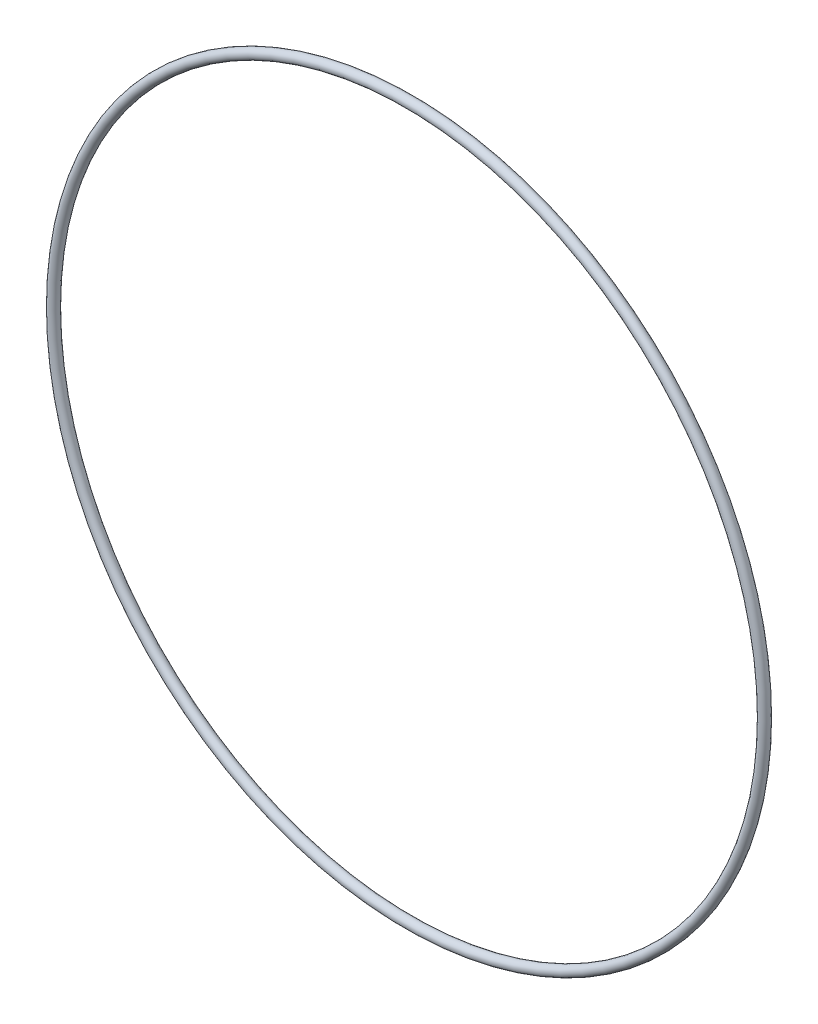
ISO-10303-21;
HEADER;
FILE_DESCRIPTION(('STEP AP214'),'2;1');
FILE_NAME('part.step','',(''),(''),'','','');
FILE_SCHEMA(('AUTOMOTIVE_DESIGN { 1 0 10303 214 1 1 1 1 }'));
ENDSEC;
DATA;
#1=APPLICATION_CONTEXT('core data for automotive mechanical design processes');
#2=APPLICATION_PROTOCOL_DEFINITION('international standard','automotive_design',2000,#1);
#3=PRODUCT_CONTEXT('',#1,'mechanical');
#4=PRODUCT('Part','Part','',(#3));
#5=PRODUCT_RELATED_PRODUCT_CATEGORY('part','',(#4));
#6=PRODUCT_DEFINITION_FORMATION('','',#4);
#7=PRODUCT_DEFINITION_CONTEXT('part definition',#1,'design');
#8=PRODUCT_DEFINITION('design','',#6,#7);
#9=PRODUCT_DEFINITION_SHAPE('','',#8);
#10=(LENGTH_UNIT() NAMED_UNIT(*) SI_UNIT(.MILLI.,.METRE.));
#11=(NAMED_UNIT(*) PLANE_ANGLE_UNIT() SI_UNIT($,.RADIAN.));
#12=(NAMED_UNIT(*) SI_UNIT($,.STERADIAN.) SOLID_ANGLE_UNIT());
#13=UNCERTAINTY_MEASURE_WITH_UNIT(LENGTH_MEASURE(1.E-05),#10,'distance_accuracy_value','');
#14=(GEOMETRIC_REPRESENTATION_CONTEXT(3) GLOBAL_UNCERTAINTY_ASSIGNED_CONTEXT((#13)) GLOBAL_UNIT_ASSIGNED_CONTEXT((#10,
#11,#12)) REPRESENTATION_CONTEXT('',''));
#15=CARTESIAN_POINT('',(0.,0.,0.));
#16=DIRECTION('',(0.,0.,1.));
#17=DIRECTION('',(1.,0.,0.));
#18=AXIS2_PLACEMENT_3D('',#15,#16,#17);
#19=CARTESIAN_POINT('',(0.,0.,0.));
#20=DIRECTION('',(0.,0.,1.));
#21=DIRECTION('',(1.,0.,0.));
#22=AXIS2_PLACEMENT_3D('',#19,#20,#21);
#23=TOROIDAL_SURFACE('',#22,106.25,1.5);
#24=CARTESIAN_POINT('',(107.75,0.,0.));
#25=VERTEX_POINT('',#24);
#26=VERTEX_LOOP('',#25);
#27=FACE_BOUND('',#26,.T.);
#28=ADVANCED_FACE('F40',(#27),#23,.T.);
#29=CLOSED_SHELL('',(#28));
#30=MANIFOLD_SOLID_BREP('B2',#29);
#31=ADVANCED_BREP_SHAPE_REPRESENTATION('',(#18,#30),#14);
#32=SHAPE_DEFINITION_REPRESENTATION(#9,#31);
ENDSEC;
END-ISO-10303-21;
